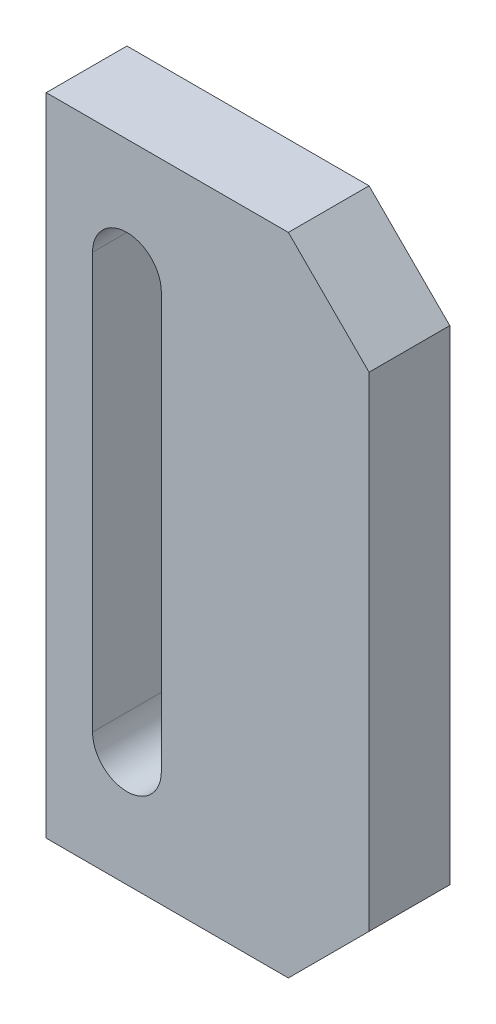
ISO-10303-21;
HEADER;
FILE_DESCRIPTION(('STEP AP214'),'2;1');
FILE_NAME('part.step','',(''),(''),'','','');
FILE_SCHEMA(('AUTOMOTIVE_DESIGN { 1 0 10303 214 1 1 1 1 }'));
ENDSEC;
DATA;
#1=APPLICATION_CONTEXT('core data for automotive mechanical design processes');
#2=APPLICATION_PROTOCOL_DEFINITION('international standard','automotive_design',2000,#1);
#3=PRODUCT_CONTEXT('',#1,'mechanical');
#4=PRODUCT('Part','Part','',(#3));
#5=PRODUCT_RELATED_PRODUCT_CATEGORY('part','',(#4));
#6=PRODUCT_DEFINITION_FORMATION('','',#4);
#7=PRODUCT_DEFINITION_CONTEXT('part definition',#1,'design');
#8=PRODUCT_DEFINITION('design','',#6,#7);
#9=PRODUCT_DEFINITION_SHAPE('','',#8);
#10=(LENGTH_UNIT() NAMED_UNIT(*) SI_UNIT(.MILLI.,.METRE.));
#11=(NAMED_UNIT(*) PLANE_ANGLE_UNIT() SI_UNIT($,.RADIAN.));
#12=(NAMED_UNIT(*) SI_UNIT($,.STERADIAN.) SOLID_ANGLE_UNIT());
#13=UNCERTAINTY_MEASURE_WITH_UNIT(LENGTH_MEASURE(1.E-05),#10,'distance_accuracy_value','');
#14=(GEOMETRIC_REPRESENTATION_CONTEXT(3) GLOBAL_UNCERTAINTY_ASSIGNED_CONTEXT((#13)) GLOBAL_UNIT_ASSIGNED_CONTEXT((#10,
#11,#12)) REPRESENTATION_CONTEXT('',''));
#15=CARTESIAN_POINT('',(0.,0.,0.));
#16=DIRECTION('',(0.,0.,1.));
#17=DIRECTION('',(1.,0.,0.));
#18=AXIS2_PLACEMENT_3D('',#15,#16,#17);
#19=CARTESIAN_POINT('',(112.797481179877,-2418.98300415444,3.175));
#20=DIRECTION('',(1.,0.,0.));
#21=DIRECTION('',(0.,0.,-1.));
#22=AXIS2_PLACEMENT_3D('',#19,#20,#21);
#23=PLANE('',#22);
#24=DIRECTION('',(0.,-1.,0.));
#25=VECTOR('',#24,1.);
#26=CARTESIAN_POINT('',(112.797481179877,-2418.98300415444,0.));
#27=LINE('',#26,#25);
#28=CARTESIAN_POINT('',(112.797481179877,-2393.58300415444,0.));
#29=VERTEX_POINT('',#28);
#30=CARTESIAN_POINT('',(112.797481179877,-2418.98300415444,0.));
#31=VERTEX_POINT('',#30);
#32=EDGE_CURVE('E194',#29,#31,#27,.T.);
#33=ORIENTED_EDGE('',*,*,#32,.T.);
#34=DIRECTION('',(0.,0.,-1.));
#35=VECTOR('',#34,1.);
#36=CARTESIAN_POINT('',(112.797481179877,-2418.98300415444,3.175));
#37=LINE('',#36,#35);
#38=CARTESIAN_POINT('',(112.797481179877,-2418.98300415444,3.175));
#39=VERTEX_POINT('',#38);
#40=EDGE_CURVE('E239',#39,#31,#37,.T.);
#41=ORIENTED_EDGE('',*,*,#40,.F.);
#42=DIRECTION('',(0.,-1.,0.));
#43=VECTOR('',#42,1.);
#44=CARTESIAN_POINT('',(112.797481179877,-2418.98300415444,3.175));
#45=LINE('',#44,#43);
#46=CARTESIAN_POINT('',(112.797481179877,-2393.58300415444,3.175));
#47=VERTEX_POINT('',#46);
#48=EDGE_CURVE('E215',#47,#39,#45,.T.);
#49=ORIENTED_EDGE('',*,*,#48,.F.);
#50=DIRECTION('',(0.,0.,-1.));
#51=VECTOR('',#50,1.);
#52=CARTESIAN_POINT('',(112.797481179877,-2393.58300415444,3.175));
#53=LINE('',#52,#51);
#54=EDGE_CURVE('E227',#47,#29,#53,.T.);
#55=ORIENTED_EDGE('',*,*,#54,.T.);
#56=EDGE_LOOP('',(#33,#41,#49,#55));
#57=FACE_BOUND('',#56,.T.);
#58=ADVANCED_FACE('F109',(#57),#23,.F.);
#59=CARTESIAN_POINT('',(112.797481179877,-2418.98300415444,3.175));
#60=DIRECTION('',(0.,1.,0.));
#61=DIRECTION('',(0.,0.,1.));
#62=AXIS2_PLACEMENT_3D('',#59,#60,#61);
#63=PLANE('',#62);
#64=DIRECTION('',(1.,0.,0.));
#65=VECTOR('',#64,1.);
#66=CARTESIAN_POINT('',(112.797481179877,-2418.98300415444,0.));
#67=LINE('',#66,#65);
#68=CARTESIAN_POINT('',(122.322481179877,-2418.98300415444,0.));
#69=VERTEX_POINT('',#68);
#70=EDGE_CURVE('E230',#31,#69,#67,.T.);
#71=ORIENTED_EDGE('',*,*,#70,.T.);
#72=DIRECTION('',(0.,0.,1.));
#73=VECTOR('',#72,1.);
#74=CARTESIAN_POINT('',(122.322481179877,-2418.98300415444,3.175));
#75=LINE('',#74,#73);
#76=CARTESIAN_POINT('',(122.322481179877,-2418.98300415444,3.175));
#77=VERTEX_POINT('',#76);
#78=EDGE_CURVE('E251',#69,#77,#75,.T.);
#79=ORIENTED_EDGE('',*,*,#78,.T.);
#80=DIRECTION('',(1.,0.,0.));
#81=VECTOR('',#80,1.);
#82=CARTESIAN_POINT('',(112.797481179877,-2418.98300415444,3.175));
#83=LINE('',#82,#81);
#84=EDGE_CURVE('E218',#39,#77,#83,.T.);
#85=ORIENTED_EDGE('',*,*,#84,.F.);
#86=ORIENTED_EDGE('',*,*,#40,.T.);
#87=EDGE_LOOP('',(#71,#79,#85,#86));
#88=FACE_BOUND('',#87,.T.);
#89=ADVANCED_FACE('F280',(#88),#63,.F.);
#90=CARTESIAN_POINT('',(125.497481179877,-2418.98300415444,3.175));
#91=DIRECTION('',(-1.,0.,0.));
#92=DIRECTION('',(0.,0.,1.));
#93=AXIS2_PLACEMENT_3D('',#90,#91,#92);
#94=PLANE('',#93);
#95=DIRECTION('',(0.,1.,0.));
#96=VECTOR('',#95,1.);
#97=CARTESIAN_POINT('',(125.497481179877,-2418.98300415444,3.175));
#98=LINE('',#97,#96);
#99=CARTESIAN_POINT('',(125.497481179877,-2415.80800415444,3.175));
#100=VERTEX_POINT('',#99);
#101=CARTESIAN_POINT('',(125.497481179877,-2396.75800415444,3.175));
#102=VERTEX_POINT('',#101);
#103=EDGE_CURVE('E222',#100,#102,#98,.T.);
#104=ORIENTED_EDGE('',*,*,#103,.F.);
#105=DIRECTION('',(0.,0.,-1.));
#106=VECTOR('',#105,1.);
#107=CARTESIAN_POINT('',(125.497481179877,-2415.80800415444,3.175));
#108=LINE('',#107,#106);
#109=CARTESIAN_POINT('',(125.497481179877,-2415.80800415444,0.));
#110=VERTEX_POINT('',#109);
#111=EDGE_CURVE('E244',#100,#110,#108,.T.);
#112=ORIENTED_EDGE('',*,*,#111,.T.);
#113=DIRECTION('',(0.,1.,0.));
#114=VECTOR('',#113,1.);
#115=CARTESIAN_POINT('',(125.497481179877,-2418.98300415444,0.));
#116=LINE('',#115,#114);
#117=CARTESIAN_POINT('',(125.497481179877,-2396.75800415444,0.));
#118=VERTEX_POINT('',#117);
#119=EDGE_CURVE('E233',#110,#118,#116,.T.);
#120=ORIENTED_EDGE('',*,*,#119,.T.);
#121=DIRECTION('',(0.,0.,1.));
#122=VECTOR('',#121,1.);
#123=CARTESIAN_POINT('',(125.497481179877,-2396.75800415444,3.175));
#124=LINE('',#123,#122);
#125=EDGE_CURVE('E242',#118,#102,#124,.T.);
#126=ORIENTED_EDGE('',*,*,#125,.T.);
#127=EDGE_LOOP('',(#104,#112,#120,#126));
#128=FACE_BOUND('',#127,.T.);
#129=ADVANCED_FACE('F286',(#128),#94,.F.);
#130=CARTESIAN_POINT('',(112.797481179877,-2393.58300415444,3.175));
#131=DIRECTION('',(0.,-1.,0.));
#132=DIRECTION('',(0.,0.,-1.));
#133=AXIS2_PLACEMENT_3D('',#130,#131,#132);
#134=PLANE('',#133);
#135=DIRECTION('',(-1.,0.,0.));
#136=VECTOR('',#135,1.);
#137=CARTESIAN_POINT('',(112.797481179877,-2393.58300415444,3.175));
#138=LINE('',#137,#136);
#139=CARTESIAN_POINT('',(122.322481179876,-2393.58300415444,3.175));
#140=VERTEX_POINT('',#139);
#141=EDGE_CURVE('E225',#140,#47,#138,.T.);
#142=ORIENTED_EDGE('',*,*,#141,.F.);
#143=DIRECTION('',(0.,0.,-1.));
#144=VECTOR('',#143,1.);
#145=CARTESIAN_POINT('',(122.322481179876,-2393.58300415444,3.175));
#146=LINE('',#145,#144);
#147=CARTESIAN_POINT('',(122.322481179876,-2393.58300415444,0.));
#148=VERTEX_POINT('',#147);
#149=EDGE_CURVE('E257',#140,#148,#146,.T.);
#150=ORIENTED_EDGE('',*,*,#149,.T.);
#151=DIRECTION('',(-1.,0.,0.));
#152=VECTOR('',#151,1.);
#153=CARTESIAN_POINT('',(112.797481179877,-2393.58300415444,0.));
#154=LINE('',#153,#152);
#155=EDGE_CURVE('E219',#148,#29,#154,.T.);
#156=ORIENTED_EDGE('',*,*,#155,.T.);
#157=ORIENTED_EDGE('',*,*,#54,.F.);
#158=EDGE_LOOP('',(#142,#150,#156,#157));
#159=FACE_BOUND('',#158,.T.);
#160=ADVANCED_FACE('F314',(#159),#134,.F.);
#161=CARTESIAN_POINT('',(0.,0.,3.175));
#162=DIRECTION('',(0.,0.,-1.));
#163=DIRECTION('',(-1.,0.,0.));
#164=AXIS2_PLACEMENT_3D('',#161,#162,#163);
#165=PLANE('',#164);
#166=CARTESIAN_POINT('',(115.972481179877,-2414.45545415444,3.175));
#167=DIRECTION('',(0.,0.,1.));
#168=DIRECTION('',(1.,0.,0.));
#169=AXIS2_PLACEMENT_3D('',#166,#167,#168);
#170=CIRCLE('',#169,1.35254999999999);
#171=CARTESIAN_POINT('',(114.619931179877,-2414.45545415444,3.175));
#172=VERTEX_POINT('',#171);
#173=CARTESIAN_POINT('',(117.325031179877,-2414.45545415444,3.175));
#174=VERTEX_POINT('',#173);
#175=EDGE_CURVE('E205',#172,#174,#170,.T.);
#176=ORIENTED_EDGE('',*,*,#175,.F.);
#177=DIRECTION('',(0.,1.,0.));
#178=VECTOR('',#177,1.);
#179=CARTESIAN_POINT('',(114.619931179877,-2414.45545415444,3.175));
#180=LINE('',#179,#178);
#181=CARTESIAN_POINT('',(114.619931179877,-2398.11055415444,3.175));
#182=VERTEX_POINT('',#181);
#183=EDGE_CURVE('E189',#172,#182,#180,.T.);
#184=ORIENTED_EDGE('',*,*,#183,.T.);
#185=CARTESIAN_POINT('',(115.972481179877,-2398.11055415444,3.175));
#186=DIRECTION('',(0.,0.,1.));
#187=DIRECTION('',(1.,0.,0.));
#188=AXIS2_PLACEMENT_3D('',#185,#186,#187);
#189=CIRCLE('',#188,1.35254999999999);
#190=CARTESIAN_POINT('',(117.325031179877,-2398.11055415444,3.175));
#191=VERTEX_POINT('',#190);
#192=EDGE_CURVE('E195',#191,#182,#189,.T.);
#193=ORIENTED_EDGE('',*,*,#192,.F.);
#194=DIRECTION('',(0.,1.,0.));
#195=VECTOR('',#194,1.);
#196=CARTESIAN_POINT('',(117.325031179877,-2414.45545415444,3.175));
#197=LINE('',#196,#195);
#198=EDGE_CURVE('E206',#174,#191,#197,.T.);
#199=ORIENTED_EDGE('',*,*,#198,.F.);
#200=EDGE_LOOP('',(#176,#184,#193,#199));
#201=FACE_BOUND('',#200,.T.);
#202=ORIENTED_EDGE('',*,*,#84,.T.);
#203=DIRECTION('',(-0.707106781186524,-0.707106781186571,0.));
#204=VECTOR('',#203,1.);
#205=CARTESIAN_POINT('',(125.497481179877,-2415.80800415444,3.175));
#206=LINE('',#205,#204);
#207=EDGE_CURVE('E255',#77,#100,#206,.F.);
#208=ORIENTED_EDGE('',*,*,#207,.T.);
#209=ORIENTED_EDGE('',*,*,#103,.T.);
#210=DIRECTION('',(0.707106781186563,-0.707106781186532,0.));
#211=VECTOR('',#210,1.);
#212=CARTESIAN_POINT('',(122.322481179876,-2393.58300415444,3.175));
#213=LINE('',#212,#211);
#214=EDGE_CURVE('E253',#102,#140,#213,.F.);
#215=ORIENTED_EDGE('',*,*,#214,.T.);
#216=ORIENTED_EDGE('',*,*,#141,.T.);
#217=ORIENTED_EDGE('',*,*,#48,.T.);
#218=EDGE_LOOP('',(#202,#208,#209,#215,#216,#217));
#219=FACE_BOUND('',#218,.T.);
#220=ADVANCED_FACE('F203',(#201,#219),#165,.F.);
#221=CARTESIAN_POINT('',(0.,0.,0.));
#222=DIRECTION('',(0.,0.,-1.));
#223=DIRECTION('',(-1.,0.,0.));
#224=AXIS2_PLACEMENT_3D('',#221,#222,#223);
#225=PLANE('',#224);
#226=DIRECTION('',(0.,1.,0.));
#227=VECTOR('',#226,1.);
#228=CARTESIAN_POINT('',(114.619931179877,0.,0.));
#229=LINE('',#228,#227);
#230=CARTESIAN_POINT('',(114.619931179877,-2414.45545415444,0.));
#231=VERTEX_POINT('',#230);
#232=CARTESIAN_POINT('',(114.619931179877,-2398.11055415444,0.));
#233=VERTEX_POINT('',#232);
#234=EDGE_CURVE('E13',#231,#233,#229,.T.);
#235=ORIENTED_EDGE('',*,*,#234,.F.);
#236=CARTESIAN_POINT('',(115.972481179877,-2414.45545415444,0.));
#237=DIRECTION('',(0.,0.,-1.));
#238=DIRECTION('',(-1.,0.,0.));
#239=AXIS2_PLACEMENT_3D('',#236,#237,#238);
#240=CIRCLE('',#239,1.35254999999999);
#241=CARTESIAN_POINT('',(117.325031179877,-2414.45545415444,0.));
#242=VERTEX_POINT('',#241);
#243=EDGE_CURVE('E262',#242,#231,#240,.T.);
#244=ORIENTED_EDGE('',*,*,#243,.F.);
#245=DIRECTION('',(0.,-1.,0.));
#246=VECTOR('',#245,1.);
#247=CARTESIAN_POINT('',(117.325031179877,0.,0.));
#248=LINE('',#247,#246);
#249=CARTESIAN_POINT('',(117.325031179877,-2398.11055415444,0.));
#250=VERTEX_POINT('',#249);
#251=EDGE_CURVE('E260',#250,#242,#248,.T.);
#252=ORIENTED_EDGE('',*,*,#251,.F.);
#253=CARTESIAN_POINT('',(115.972481179877,-2398.11055415444,0.));
#254=DIRECTION('',(0.,0.,-1.));
#255=DIRECTION('',(-1.,0.,0.));
#256=AXIS2_PLACEMENT_3D('',#253,#254,#255);
#257=CIRCLE('',#256,1.35254999999999);
#258=EDGE_CURVE('E118',#233,#250,#257,.T.);
#259=ORIENTED_EDGE('',*,*,#258,.F.);
#260=EDGE_LOOP('',(#235,#244,#252,#259));
#261=FACE_BOUND('',#260,.T.);
#262=ORIENTED_EDGE('',*,*,#119,.F.);
#263=DIRECTION('',(0.707106781186524,0.707106781186571,0.));
#264=VECTOR('',#263,1.);
#265=CARTESIAN_POINT('',(1270.65274266716,-1270.65274266708,0.));
#266=LINE('',#265,#264);
#267=EDGE_CURVE('E249',#110,#69,#266,.F.);
#268=ORIENTED_EDGE('',*,*,#267,.T.);
#269=ORIENTED_EDGE('',*,*,#70,.F.);
#270=ORIENTED_EDGE('',*,*,#32,.F.);
#271=ORIENTED_EDGE('',*,*,#155,.F.);
#272=DIRECTION('',(-0.707106781186563,0.707106781186532,0.));
#273=VECTOR('',#272,1.);
#274=CARTESIAN_POINT('',(-1135.63026148729,-1135.63026148734,0.));
#275=LINE('',#274,#273);
#276=EDGE_CURVE('E247',#148,#118,#275,.F.);
#277=ORIENTED_EDGE('',*,*,#276,.T.);
#278=EDGE_LOOP('',(#262,#268,#269,#270,#271,#277));
#279=FACE_BOUND('',#278,.T.);
#280=ADVANCED_FACE('F266',(#261,#279),#225,.T.);
#281=CARTESIAN_POINT('',(125.497481179877,-2415.80800415444,3.175));
#282=DIRECTION('',(-0.707106781186571,0.707106781186524,0.));
#283=DIRECTION('',(0.,0.,-1.));
#284=AXIS2_PLACEMENT_3D('',#281,#282,#283);
#285=PLANE('',#284);
#286=ORIENTED_EDGE('',*,*,#207,.F.);
#287=ORIENTED_EDGE('',*,*,#78,.F.);
#288=ORIENTED_EDGE('',*,*,#267,.F.);
#289=ORIENTED_EDGE('',*,*,#111,.F.);
#290=EDGE_LOOP('',(#286,#287,#288,#289));
#291=FACE_BOUND('',#290,.T.);
#292=ADVANCED_FACE('F291',(#291),#285,.F.);
#293=CARTESIAN_POINT('',(122.322481179876,-2393.58300415444,3.175));
#294=DIRECTION('',(-0.707106781186532,-0.707106781186563,0.));
#295=DIRECTION('',(0.,0.,-1.));
#296=AXIS2_PLACEMENT_3D('',#293,#294,#295);
#297=PLANE('',#296);
#298=ORIENTED_EDGE('',*,*,#214,.F.);
#299=ORIENTED_EDGE('',*,*,#125,.F.);
#300=ORIENTED_EDGE('',*,*,#276,.F.);
#301=ORIENTED_EDGE('',*,*,#149,.F.);
#302=EDGE_LOOP('',(#298,#299,#300,#301));
#303=FACE_BOUND('',#302,.T.);
#304=ADVANCED_FACE('F112',(#303),#297,.F.);
#305=CARTESIAN_POINT('',(115.972481179877,-2398.11055415444,3.175));
#306=DIRECTION('',(0.,0.,1.));
#307=DIRECTION('',(1.,0.,0.));
#308=AXIS2_PLACEMENT_3D('',#305,#306,#307);
#309=CYLINDRICAL_SURFACE('',#308,1.35254999999999);
#310=ORIENTED_EDGE('',*,*,#258,.T.);
#311=DIRECTION('',(0.,0.,-1.));
#312=VECTOR('',#311,1.);
#313=CARTESIAN_POINT('',(117.325031179877,-2398.11055415444,-3.175));
#314=LINE('',#313,#312);
#315=EDGE_CURVE('E130',#191,#250,#314,.T.);
#316=ORIENTED_EDGE('',*,*,#315,.F.);
#317=ORIENTED_EDGE('',*,*,#192,.T.);
#318=DIRECTION('',(0.,0.,1.));
#319=VECTOR('',#318,1.);
#320=CARTESIAN_POINT('',(114.619931179877,-2398.11055415444,3.175));
#321=LINE('',#320,#319);
#322=EDGE_CURVE('E184',#233,#182,#321,.T.);
#323=ORIENTED_EDGE('',*,*,#322,.F.);
#324=EDGE_LOOP('',(#310,#316,#317,#323));
#325=FACE_BOUND('',#324,.T.);
#326=ADVANCED_FACE('F198',(#325),#309,.F.);
#327=CARTESIAN_POINT('',(115.972481179877,-2414.45545415444,3.175));
#328=DIRECTION('',(0.,0.,1.));
#329=DIRECTION('',(1.,0.,0.));
#330=AXIS2_PLACEMENT_3D('',#327,#328,#329);
#331=CYLINDRICAL_SURFACE('',#330,1.35254999999999);
#332=ORIENTED_EDGE('',*,*,#243,.T.);
#333=DIRECTION('',(0.,0.,1.));
#334=VECTOR('',#333,1.);
#335=CARTESIAN_POINT('',(114.619931179877,-2414.45545415444,3.175));
#336=LINE('',#335,#334);
#337=EDGE_CURVE('E212',#172,#231,#336,.F.);
#338=ORIENTED_EDGE('',*,*,#337,.F.);
#339=ORIENTED_EDGE('',*,*,#175,.T.);
#340=DIRECTION('',(0.,0.,-1.));
#341=VECTOR('',#340,1.);
#342=CARTESIAN_POINT('',(117.325031179877,-2414.45545415444,-3.175));
#343=LINE('',#342,#341);
#344=EDGE_CURVE('E125',#174,#242,#343,.T.);
#345=ORIENTED_EDGE('',*,*,#344,.T.);
#346=EDGE_LOOP('',(#332,#338,#339,#345));
#347=FACE_BOUND('',#346,.T.);
#348=ADVANCED_FACE('F270',(#347),#331,.F.);
#349=CARTESIAN_POINT('',(114.619931179877,-2414.45545415444,3.175));
#350=DIRECTION('',(-1.,0.,0.));
#351=DIRECTION('',(0.,0.,1.));
#352=AXIS2_PLACEMENT_3D('',#349,#350,#351);
#353=PLANE('',#352);
#354=ORIENTED_EDGE('',*,*,#234,.T.);
#355=ORIENTED_EDGE('',*,*,#322,.T.);
#356=ORIENTED_EDGE('',*,*,#183,.F.);
#357=ORIENTED_EDGE('',*,*,#337,.T.);
#358=EDGE_LOOP('',(#354,#355,#356,#357));
#359=FACE_BOUND('',#358,.T.);
#360=ADVANCED_FACE('F186',(#359),#353,.F.);
#361=CARTESIAN_POINT('',(117.325031179877,-2414.45545415444,-3.175));
#362=DIRECTION('',(1.,0.,0.));
#363=DIRECTION('',(0.,0.,-1.));
#364=AXIS2_PLACEMENT_3D('',#361,#362,#363);
#365=PLANE('',#364);
#366=ORIENTED_EDGE('',*,*,#251,.T.);
#367=ORIENTED_EDGE('',*,*,#344,.F.);
#368=ORIENTED_EDGE('',*,*,#198,.T.);
#369=ORIENTED_EDGE('',*,*,#315,.T.);
#370=EDGE_LOOP('',(#366,#367,#368,#369));
#371=FACE_BOUND('',#370,.T.);
#372=ADVANCED_FACE('F268',(#371),#365,.F.);
#373=CLOSED_SHELL('',(#58,#89,#129,#160,#220,#280,#292,#304,#326,#348,#360,#372));
#374=MANIFOLD_SOLID_BREP('B2',#373);
#375=ADVANCED_BREP_SHAPE_REPRESENTATION('',(#18,#374),#14);
#376=SHAPE_DEFINITION_REPRESENTATION(#9,#375);
ENDSEC;
END-ISO-10303-21;
